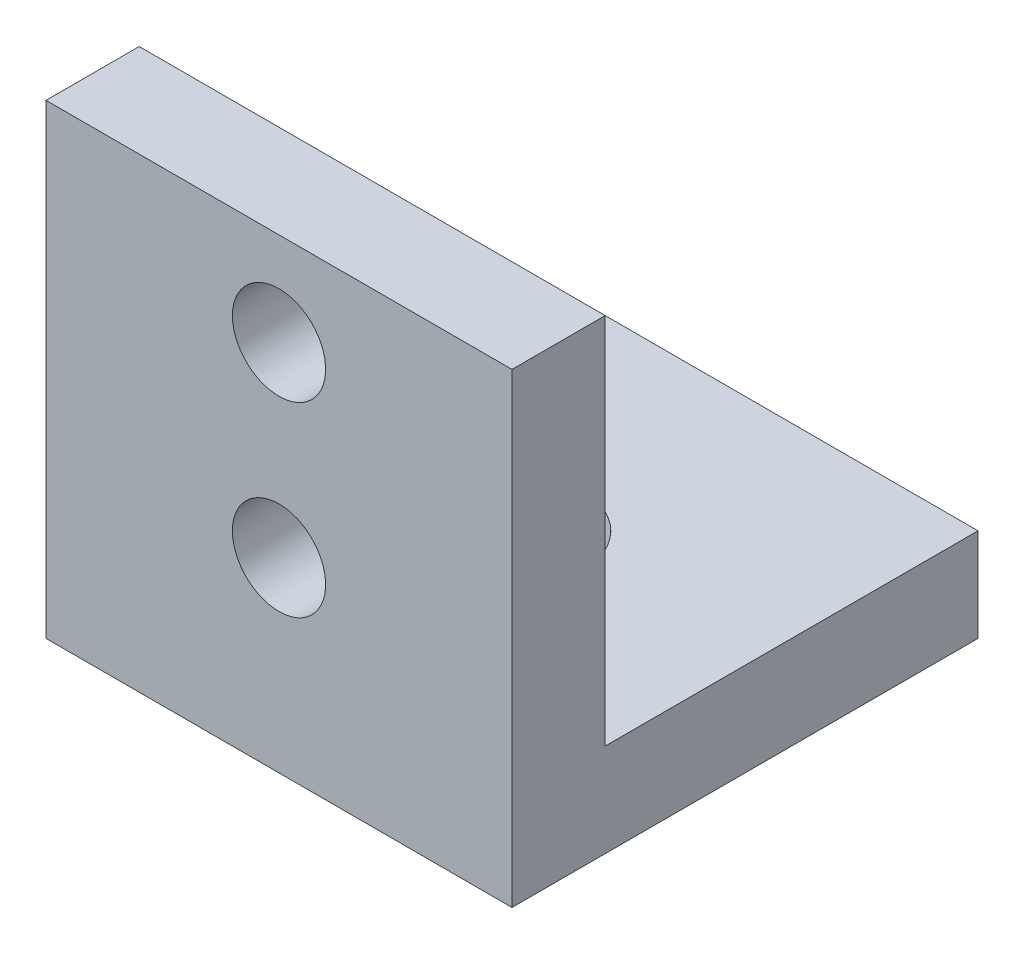
ISO-10303-21;
HEADER;
FILE_DESCRIPTION(('STEP AP214'),'2;1');
FILE_NAME('part.step','',(''),(''),'','','');
FILE_SCHEMA(('AUTOMOTIVE_DESIGN { 1 0 10303 214 1 1 1 1 }'));
ENDSEC;
DATA;
#1=APPLICATION_CONTEXT('core data for automotive mechanical design processes');
#2=APPLICATION_PROTOCOL_DEFINITION('international standard','automotive_design',2000,#1);
#3=PRODUCT_CONTEXT('',#1,'mechanical');
#4=PRODUCT('Part','Part','',(#3));
#5=PRODUCT_RELATED_PRODUCT_CATEGORY('part','',(#4));
#6=PRODUCT_DEFINITION_FORMATION('','',#4);
#7=PRODUCT_DEFINITION_CONTEXT('part definition',#1,'design');
#8=PRODUCT_DEFINITION('design','',#6,#7);
#9=PRODUCT_DEFINITION_SHAPE('','',#8);
#10=(LENGTH_UNIT() NAMED_UNIT(*) SI_UNIT(.MILLI.,.METRE.));
#11=(NAMED_UNIT(*) PLANE_ANGLE_UNIT() SI_UNIT($,.RADIAN.));
#12=(NAMED_UNIT(*) SI_UNIT($,.STERADIAN.) SOLID_ANGLE_UNIT());
#13=UNCERTAINTY_MEASURE_WITH_UNIT(LENGTH_MEASURE(1.E-05),#10,'distance_accuracy_value','');
#14=(GEOMETRIC_REPRESENTATION_CONTEXT(3) GLOBAL_UNCERTAINTY_ASSIGNED_CONTEXT((#13)) GLOBAL_UNIT_ASSIGNED_CONTEXT((#10,
#11,#12)) REPRESENTATION_CONTEXT('',''));
#15=CARTESIAN_POINT('',(0.,0.,0.));
#16=DIRECTION('',(0.,0.,1.));
#17=DIRECTION('',(1.,0.,0.));
#18=AXIS2_PLACEMENT_3D('',#15,#16,#17);
#19=CARTESIAN_POINT('',(0.,5.08,0.));
#20=DIRECTION('',(0.,-1.,0.));
#21=DIRECTION('',(0.,0.,-1.));
#22=AXIS2_PLACEMENT_3D('',#19,#20,#21);
#23=PLANE('',#22);
#24=CARTESIAN_POINT('',(0.,5.08,0.));
#25=DIRECTION('',(0.,1.,0.));
#26=DIRECTION('',(0.,0.,1.));
#27=AXIS2_PLACEMENT_3D('',#24,#25,#26);
#28=CIRCLE('',#27,3.81);
#29=CARTESIAN_POINT('',(0.,5.08,3.81));
#30=VERTEX_POINT('',#29);
#31=EDGE_CURVE('E109',#30,#30,#28,.T.);
#32=ORIENTED_EDGE('',*,*,#31,.F.);
#33=EDGE_LOOP('',(#32));
#34=FACE_BOUND('',#33,.T.);
#35=DIRECTION('',(-1.,0.,0.));
#36=VECTOR('',#35,1.);
#37=CARTESIAN_POINT('',(-12.7,5.08,7.62));
#38=LINE('',#37,#36);
#39=CARTESIAN_POINT('',(12.7,5.08,7.62));
#40=VERTEX_POINT('',#39);
#41=CARTESIAN_POINT('',(-12.7,5.08,7.62));
#42=VERTEX_POINT('',#41);
#43=EDGE_CURVE('E55',#40,#42,#38,.T.);
#44=ORIENTED_EDGE('',*,*,#43,.F.);
#45=DIRECTION('',(0.,0.,-1.));
#46=VECTOR('',#45,1.);
#47=CARTESIAN_POINT('',(12.7,5.08,12.7));
#48=LINE('',#47,#46);
#49=CARTESIAN_POINT('',(12.7,5.08,-12.7));
#50=VERTEX_POINT('',#49);
#51=EDGE_CURVE('E93',#40,#50,#48,.T.);
#52=ORIENTED_EDGE('',*,*,#51,.T.);
#53=DIRECTION('',(-1.,0.,0.));
#54=VECTOR('',#53,1.);
#55=CARTESIAN_POINT('',(-12.7,5.08,-12.7));
#56=LINE('',#55,#54);
#57=CARTESIAN_POINT('',(-12.7,5.08,-12.7));
#58=VERTEX_POINT('',#57);
#59=EDGE_CURVE('E61',#50,#58,#56,.T.);
#60=ORIENTED_EDGE('',*,*,#59,.T.);
#61=DIRECTION('',(0.,0.,1.));
#62=VECTOR('',#61,1.);
#63=CARTESIAN_POINT('',(-12.7,5.08,12.7));
#64=LINE('',#63,#62);
#65=EDGE_CURVE('E104',#58,#42,#64,.T.);
#66=ORIENTED_EDGE('',*,*,#65,.T.);
#67=EDGE_LOOP('',(#44,#52,#60,#66));
#68=FACE_BOUND('',#67,.T.);
#69=ADVANCED_FACE('F40',(#34,#68),#23,.F.);
#70=CARTESIAN_POINT('',(0.,0.,0.));
#71=DIRECTION('',(0.,-1.,0.));
#72=DIRECTION('',(0.,0.,-1.));
#73=AXIS2_PLACEMENT_3D('',#70,#71,#72);
#74=PLANE('',#73);
#75=DIRECTION('',(0.,0.,-1.));
#76=VECTOR('',#75,1.);
#77=CARTESIAN_POINT('',(12.7,0.,12.7));
#78=LINE('',#77,#76);
#79=CARTESIAN_POINT('',(12.7,0.,12.7));
#80=VERTEX_POINT('',#79);
#81=CARTESIAN_POINT('',(12.7,0.,-12.7));
#82=VERTEX_POINT('',#81);
#83=EDGE_CURVE('E100',#80,#82,#78,.T.);
#84=ORIENTED_EDGE('',*,*,#83,.F.);
#85=DIRECTION('',(1.,0.,0.));
#86=VECTOR('',#85,1.);
#87=CARTESIAN_POINT('',(-12.7,0.,12.7));
#88=LINE('',#87,#86);
#89=CARTESIAN_POINT('',(-12.7,0.,12.7));
#90=VERTEX_POINT('',#89);
#91=EDGE_CURVE('E81',#90,#80,#88,.T.);
#92=ORIENTED_EDGE('',*,*,#91,.F.);
#93=DIRECTION('',(0.,0.,1.));
#94=VECTOR('',#93,1.);
#95=CARTESIAN_POINT('',(-12.7,0.,12.7));
#96=LINE('',#95,#94);
#97=CARTESIAN_POINT('',(-12.7,0.,-12.7));
#98=VERTEX_POINT('',#97);
#99=EDGE_CURVE('E94',#98,#90,#96,.T.);
#100=ORIENTED_EDGE('',*,*,#99,.F.);
#101=DIRECTION('',(-1.,0.,0.));
#102=VECTOR('',#101,1.);
#103=CARTESIAN_POINT('',(-12.7,0.,-12.7));
#104=LINE('',#103,#102);
#105=EDGE_CURVE('E108',#82,#98,#104,.T.);
#106=ORIENTED_EDGE('',*,*,#105,.F.);
#107=EDGE_LOOP('',(#84,#92,#100,#106));
#108=FACE_BOUND('',#107,.T.);
#109=CARTESIAN_POINT('',(0.,0.,0.));
#110=DIRECTION('',(0.,1.,0.));
#111=DIRECTION('',(0.,0.,1.));
#112=AXIS2_PLACEMENT_3D('',#109,#110,#111);
#113=CIRCLE('',#112,3.81);
#114=CARTESIAN_POINT('',(0.,0.,3.81));
#115=VERTEX_POINT('',#114);
#116=EDGE_CURVE('E113',#115,#115,#113,.T.);
#117=ORIENTED_EDGE('',*,*,#116,.T.);
#118=EDGE_LOOP('',(#117));
#119=FACE_BOUND('',#118,.T.);
#120=ADVANCED_FACE('F106',(#108,#119),#74,.T.);
#121=CARTESIAN_POINT('',(12.7,5.08,12.7));
#122=DIRECTION('',(-1.,0.,0.));
#123=DIRECTION('',(0.,0.,1.));
#124=AXIS2_PLACEMENT_3D('',#121,#122,#123);
#125=PLANE('',#124);
#126=ORIENTED_EDGE('',*,*,#83,.T.);
#127=DIRECTION('',(0.,-1.,0.));
#128=VECTOR('',#127,1.);
#129=CARTESIAN_POINT('',(12.7,5.08,-12.7));
#130=LINE('',#129,#128);
#131=EDGE_CURVE('E11',#50,#82,#130,.T.);
#132=ORIENTED_EDGE('',*,*,#131,.F.);
#133=ORIENTED_EDGE('',*,*,#51,.F.);
#134=DIRECTION('',(0.,-1.,0.));
#135=VECTOR('',#134,1.);
#136=CARTESIAN_POINT('',(12.7,25.4,7.62));
#137=LINE('',#136,#135);
#138=CARTESIAN_POINT('',(12.7,25.4,7.62));
#139=VERTEX_POINT('',#138);
#140=EDGE_CURVE('E128',#139,#40,#137,.T.);
#141=ORIENTED_EDGE('',*,*,#140,.F.);
#142=DIRECTION('',(0.,0.,-1.));
#143=VECTOR('',#142,1.);
#144=CARTESIAN_POINT('',(12.7,25.4,12.7));
#145=LINE('',#144,#143);
#146=CARTESIAN_POINT('',(12.7,25.4,12.7));
#147=VERTEX_POINT('',#146);
#148=EDGE_CURVE('E103',#147,#139,#145,.T.);
#149=ORIENTED_EDGE('',*,*,#148,.F.);
#150=DIRECTION('',(0.,-1.,0.));
#151=VECTOR('',#150,1.);
#152=CARTESIAN_POINT('',(12.7,5.08,12.7));
#153=LINE('',#152,#151);
#154=EDGE_CURVE('E86',#147,#80,#153,.T.);
#155=ORIENTED_EDGE('',*,*,#154,.T.);
#156=EDGE_LOOP('',(#126,#132,#133,#141,#149,#155));
#157=FACE_BOUND('',#156,.T.);
#158=ADVANCED_FACE('F42',(#157),#125,.F.);
#159=CARTESIAN_POINT('',(-12.7,5.08,-12.7));
#160=DIRECTION('',(0.,0.,1.));
#161=DIRECTION('',(1.,0.,0.));
#162=AXIS2_PLACEMENT_3D('',#159,#160,#161);
#163=PLANE('',#162);
#164=ORIENTED_EDGE('',*,*,#105,.T.);
#165=DIRECTION('',(0.,-1.,0.));
#166=VECTOR('',#165,1.);
#167=CARTESIAN_POINT('',(-12.7,5.08,-12.7));
#168=LINE('',#167,#166);
#169=EDGE_CURVE('E48',#58,#98,#168,.T.);
#170=ORIENTED_EDGE('',*,*,#169,.F.);
#171=ORIENTED_EDGE('',*,*,#59,.F.);
#172=ORIENTED_EDGE('',*,*,#131,.T.);
#173=EDGE_LOOP('',(#164,#170,#171,#172));
#174=FACE_BOUND('',#173,.T.);
#175=ADVANCED_FACE('F125',(#174),#163,.F.);
#176=CARTESIAN_POINT('',(-12.7,5.08,12.7));
#177=DIRECTION('',(1.,0.,0.));
#178=DIRECTION('',(0.,0.,-1.));
#179=AXIS2_PLACEMENT_3D('',#176,#177,#178);
#180=PLANE('',#179);
#181=ORIENTED_EDGE('',*,*,#99,.T.);
#182=DIRECTION('',(0.,-1.,0.));
#183=VECTOR('',#182,1.);
#184=CARTESIAN_POINT('',(-12.7,5.08,12.7));
#185=LINE('',#184,#183);
#186=CARTESIAN_POINT('',(-12.7,25.4,12.7));
#187=VERTEX_POINT('',#186);
#188=EDGE_CURVE('E89',#187,#90,#185,.T.);
#189=ORIENTED_EDGE('',*,*,#188,.F.);
#190=DIRECTION('',(0.,0.,1.));
#191=VECTOR('',#190,1.);
#192=CARTESIAN_POINT('',(-12.7,25.4,12.7));
#193=LINE('',#192,#191);
#194=CARTESIAN_POINT('',(-12.7,25.4,7.62));
#195=VERTEX_POINT('',#194);
#196=EDGE_CURVE('E154',#195,#187,#193,.T.);
#197=ORIENTED_EDGE('',*,*,#196,.F.);
#198=DIRECTION('',(0.,-1.,0.));
#199=VECTOR('',#198,1.);
#200=CARTESIAN_POINT('',(-12.7,25.4,7.62));
#201=LINE('',#200,#199);
#202=EDGE_CURVE('E137',#195,#42,#201,.T.);
#203=ORIENTED_EDGE('',*,*,#202,.T.);
#204=ORIENTED_EDGE('',*,*,#65,.F.);
#205=ORIENTED_EDGE('',*,*,#169,.T.);
#206=EDGE_LOOP('',(#181,#189,#197,#203,#204,#205));
#207=FACE_BOUND('',#206,.T.);
#208=ADVANCED_FACE('F122',(#207),#180,.F.);
#209=CARTESIAN_POINT('',(-12.7,5.08,12.7));
#210=DIRECTION('',(0.,0.,-1.));
#211=DIRECTION('',(-1.,0.,0.));
#212=AXIS2_PLACEMENT_3D('',#209,#210,#211);
#213=PLANE('',#212);
#214=CARTESIAN_POINT('',(0.,20.32,12.7));
#215=DIRECTION('',(0.,0.,-1.));
#216=DIRECTION('',(-1.,0.,0.));
#217=AXIS2_PLACEMENT_3D('',#214,#215,#216);
#218=CIRCLE('',#217,2.54);
#219=CARTESIAN_POINT('',(-2.54,20.32,12.7));
#220=VERTEX_POINT('',#219);
#221=EDGE_CURVE('E157',#220,#220,#218,.T.);
#222=ORIENTED_EDGE('',*,*,#221,.T.);
#223=EDGE_LOOP('',(#222));
#224=FACE_BOUND('',#223,.T.);
#225=CARTESIAN_POINT('',(0.,10.16,12.7));
#226=DIRECTION('',(0.,0.,-1.));
#227=DIRECTION('',(-1.,0.,0.));
#228=AXIS2_PLACEMENT_3D('',#225,#226,#227);
#229=CIRCLE('',#228,2.54);
#230=CARTESIAN_POINT('',(-2.54,10.16,12.7));
#231=VERTEX_POINT('',#230);
#232=EDGE_CURVE('E164',#231,#231,#229,.T.);
#233=ORIENTED_EDGE('',*,*,#232,.T.);
#234=EDGE_LOOP('',(#233));
#235=FACE_BOUND('',#234,.T.);
#236=ORIENTED_EDGE('',*,*,#91,.T.);
#237=ORIENTED_EDGE('',*,*,#154,.F.);
#238=DIRECTION('',(1.,0.,0.));
#239=VECTOR('',#238,1.);
#240=CARTESIAN_POINT('',(-12.7,25.4,12.7));
#241=LINE('',#240,#239);
#242=EDGE_CURVE('E151',#187,#147,#241,.T.);
#243=ORIENTED_EDGE('',*,*,#242,.F.);
#244=ORIENTED_EDGE('',*,*,#188,.T.);
#245=EDGE_LOOP('',(#236,#237,#243,#244));
#246=FACE_BOUND('',#245,.T.);
#247=ADVANCED_FACE('F83',(#224,#235,#246),#213,.F.);
#248=CARTESIAN_POINT('',(0.,5.08,0.));
#249=DIRECTION('',(0.,-1.,0.));
#250=DIRECTION('',(0.,0.,-1.));
#251=AXIS2_PLACEMENT_3D('',#248,#249,#250);
#252=CYLINDRICAL_SURFACE('',#251,3.81);
#253=ORIENTED_EDGE('',*,*,#31,.T.);
#254=EDGE_LOOP('',(#253));
#255=FACE_BOUND('',#254,.T.);
#256=ORIENTED_EDGE('',*,*,#116,.F.);
#257=EDGE_LOOP('',(#256));
#258=FACE_BOUND('',#257,.T.);
#259=ADVANCED_FACE('F176',(#255,#258),#252,.F.);
#260=CARTESIAN_POINT('',(-12.7,25.4,7.62));
#261=DIRECTION('',(0.,0.,1.));
#262=DIRECTION('',(1.,0.,0.));
#263=AXIS2_PLACEMENT_3D('',#260,#261,#262);
#264=PLANE('',#263);
#265=CARTESIAN_POINT('',(0.,20.32,7.62));
#266=DIRECTION('',(0.,0.,-1.));
#267=DIRECTION('',(-1.,0.,0.));
#268=AXIS2_PLACEMENT_3D('',#265,#266,#267);
#269=CIRCLE('',#268,2.54);
#270=CARTESIAN_POINT('',(-2.54,20.32,7.62));
#271=VERTEX_POINT('',#270);
#272=EDGE_CURVE('E159',#271,#271,#269,.T.);
#273=ORIENTED_EDGE('',*,*,#272,.F.);
#274=EDGE_LOOP('',(#273));
#275=FACE_BOUND('',#274,.T.);
#276=CARTESIAN_POINT('',(0.,10.16,7.62));
#277=DIRECTION('',(0.,0.,-1.));
#278=DIRECTION('',(-1.,0.,0.));
#279=AXIS2_PLACEMENT_3D('',#276,#277,#278);
#280=CIRCLE('',#279,2.54);
#281=CARTESIAN_POINT('',(-2.54,10.16,7.62));
#282=VERTEX_POINT('',#281);
#283=EDGE_CURVE('E169',#282,#282,#280,.T.);
#284=ORIENTED_EDGE('',*,*,#283,.F.);
#285=EDGE_LOOP('',(#284));
#286=FACE_BOUND('',#285,.T.);
#287=ORIENTED_EDGE('',*,*,#43,.T.);
#288=ORIENTED_EDGE('',*,*,#202,.F.);
#289=DIRECTION('',(-1.,0.,0.));
#290=VECTOR('',#289,1.);
#291=CARTESIAN_POINT('',(-12.7,25.4,7.62));
#292=LINE('',#291,#290);
#293=EDGE_CURVE('E136',#139,#195,#292,.T.);
#294=ORIENTED_EDGE('',*,*,#293,.F.);
#295=ORIENTED_EDGE('',*,*,#140,.T.);
#296=EDGE_LOOP('',(#287,#288,#294,#295));
#297=FACE_BOUND('',#296,.T.);
#298=ADVANCED_FACE('F132',(#275,#286,#297),#264,.F.);
#299=CARTESIAN_POINT('',(0.,25.4,0.));
#300=DIRECTION('',(0.,-1.,0.));
#301=DIRECTION('',(0.,0.,-1.));
#302=AXIS2_PLACEMENT_3D('',#299,#300,#301);
#303=PLANE('',#302);
#304=ORIENTED_EDGE('',*,*,#196,.T.);
#305=ORIENTED_EDGE('',*,*,#242,.T.);
#306=ORIENTED_EDGE('',*,*,#148,.T.);
#307=ORIENTED_EDGE('',*,*,#293,.T.);
#308=EDGE_LOOP('',(#304,#305,#306,#307));
#309=FACE_BOUND('',#308,.T.);
#310=ADVANCED_FACE('F150',(#309),#303,.F.);
#311=CARTESIAN_POINT('',(0.,10.16,12.7));
#312=DIRECTION('',(0.,0.,-1.));
#313=DIRECTION('',(-1.,0.,0.));
#314=AXIS2_PLACEMENT_3D('',#311,#312,#313);
#315=CYLINDRICAL_SURFACE('',#314,2.54);
#316=ORIENTED_EDGE('',*,*,#232,.F.);
#317=EDGE_LOOP('',(#316));
#318=FACE_BOUND('',#317,.T.);
#319=ORIENTED_EDGE('',*,*,#283,.T.);
#320=EDGE_LOOP('',(#319));
#321=FACE_BOUND('',#320,.T.);
#322=ADVANCED_FACE('F173',(#318,#321),#315,.F.);
#323=CARTESIAN_POINT('',(0.,20.32,12.7));
#324=DIRECTION('',(0.,0.,-1.));
#325=DIRECTION('',(-1.,0.,0.));
#326=AXIS2_PLACEMENT_3D('',#323,#324,#325);
#327=CYLINDRICAL_SURFACE('',#326,2.54);
#328=ORIENTED_EDGE('',*,*,#221,.F.);
#329=EDGE_LOOP('',(#328));
#330=FACE_BOUND('',#329,.T.);
#331=ORIENTED_EDGE('',*,*,#272,.T.);
#332=EDGE_LOOP('',(#331));
#333=FACE_BOUND('',#332,.T.);
#334=ADVANCED_FACE('F263',(#330,#333),#327,.F.);
#335=CLOSED_SHELL('',(#69,#120,#158,#175,#208,#247,#259,#298,#310,#322,#334));
#336=MANIFOLD_SOLID_BREP('B2',#335);
#337=ADVANCED_BREP_SHAPE_REPRESENTATION('',(#18,#336),#14);
#338=SHAPE_DEFINITION_REPRESENTATION(#9,#337);
ENDSEC;
END-ISO-10303-21;
